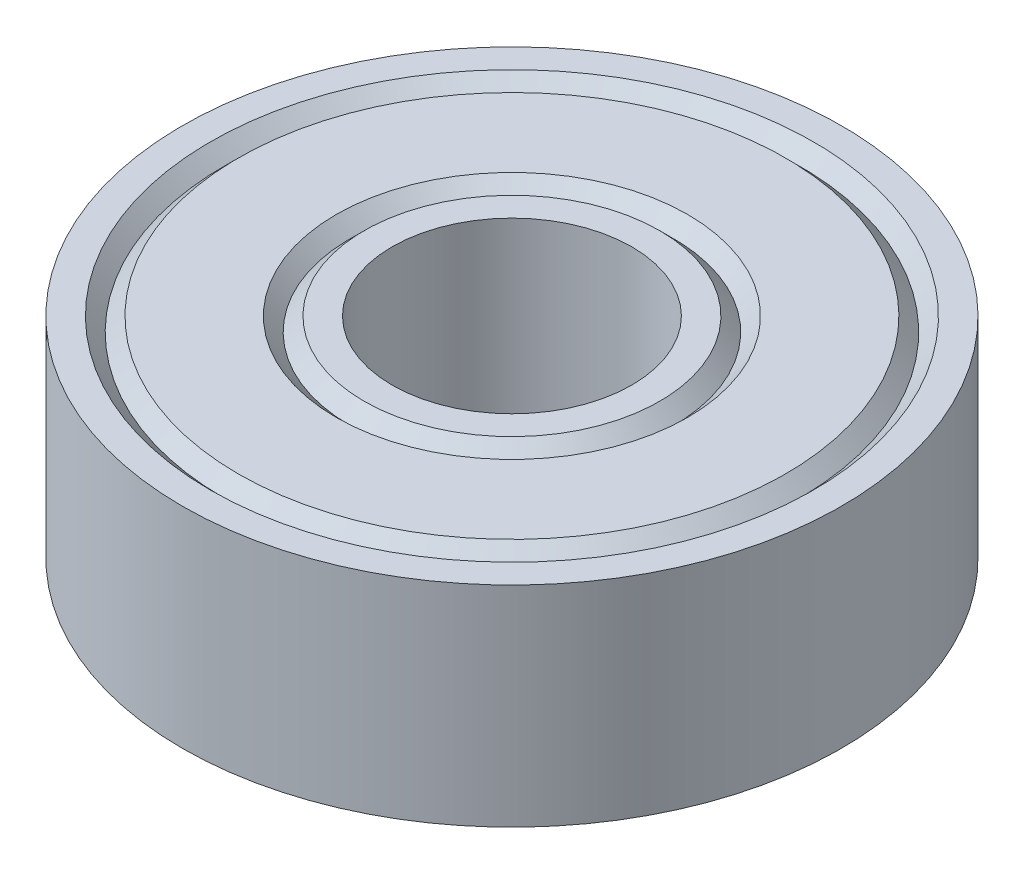
ISO-10303-21;
HEADER;
FILE_DESCRIPTION(('STEP AP214'),'2;1');
FILE_NAME('part.step','',(''),(''),'','','');
FILE_SCHEMA(('AUTOMOTIVE_DESIGN { 1 0 10303 214 1 1 1 1 }'));
ENDSEC;
DATA;
#1=APPLICATION_CONTEXT('core data for automotive mechanical design processes');
#2=APPLICATION_PROTOCOL_DEFINITION('international standard','automotive_design',2000,#1);
#3=PRODUCT_CONTEXT('',#1,'mechanical');
#4=PRODUCT('Part','Part','',(#3));
#5=PRODUCT_RELATED_PRODUCT_CATEGORY('part','',(#4));
#6=PRODUCT_DEFINITION_FORMATION('','',#4);
#7=PRODUCT_DEFINITION_CONTEXT('part definition',#1,'design');
#8=PRODUCT_DEFINITION('design','',#6,#7);
#9=PRODUCT_DEFINITION_SHAPE('','',#8);
#10=(LENGTH_UNIT() NAMED_UNIT(*) SI_UNIT(.MILLI.,.METRE.));
#11=(NAMED_UNIT(*) PLANE_ANGLE_UNIT() SI_UNIT($,.RADIAN.));
#12=(NAMED_UNIT(*) SI_UNIT($,.STERADIAN.) SOLID_ANGLE_UNIT());
#13=UNCERTAINTY_MEASURE_WITH_UNIT(LENGTH_MEASURE(1.E-05),#10,'distance_accuracy_value','');
#14=(GEOMETRIC_REPRESENTATION_CONTEXT(3) GLOBAL_UNCERTAINTY_ASSIGNED_CONTEXT((#13)) GLOBAL_UNIT_ASSIGNED_CONTEXT((#10,
#11,#12)) REPRESENTATION_CONTEXT('',''));
#15=CARTESIAN_POINT('',(0.,0.,0.));
#16=DIRECTION('',(0.,0.,1.));
#17=DIRECTION('',(1.,0.,0.));
#18=AXIS2_PLACEMENT_3D('',#15,#16,#17);
#19=CARTESIAN_POINT('',(0.,3.5,0.));
#20=DIRECTION('',(0.,1.,0.));
#21=DIRECTION('',(0.,0.,1.));
#22=AXIS2_PLACEMENT_3D('',#19,#20,#21);
#23=CYLINDRICAL_SURFACE('',#22,4.);
#24=CARTESIAN_POINT('',(0.,3.5,0.));
#25=DIRECTION('',(0.,1.,0.));
#26=DIRECTION('',(0.,0.,1.));
#27=AXIS2_PLACEMENT_3D('',#24,#25,#26);
#28=CIRCLE('',#27,4.);
#29=CARTESIAN_POINT('',(0.,3.5,4.));
#30=VERTEX_POINT('',#29);
#31=EDGE_CURVE('E84',#30,#30,#28,.T.);
#32=ORIENTED_EDGE('',*,*,#31,.T.);
#33=EDGE_LOOP('',(#32));
#34=FACE_BOUND('',#33,.T.);
#35=CARTESIAN_POINT('',(0.,-3.5,0.));
#36=DIRECTION('',(0.,1.,0.));
#37=DIRECTION('',(0.,0.,1.));
#38=AXIS2_PLACEMENT_3D('',#35,#36,#37);
#39=CIRCLE('',#38,4.);
#40=CARTESIAN_POINT('',(0.,-3.5,4.));
#41=VERTEX_POINT('',#40);
#42=EDGE_CURVE('E10',#41,#41,#39,.T.);
#43=ORIENTED_EDGE('',*,*,#42,.F.);
#44=EDGE_LOOP('',(#43));
#45=FACE_BOUND('',#44,.T.);
#46=ADVANCED_FACE('F32',(#34,#45),#23,.F.);
#47=CARTESIAN_POINT('',(-4.,-3.5,0.));
#48=DIRECTION('',(0.,-1.,0.));
#49=DIRECTION('',(0.,0.,-1.));
#50=AXIS2_PLACEMENT_3D('',#47,#48,#49);
#51=PLANE('',#50);
#52=ORIENTED_EDGE('',*,*,#42,.T.);
#53=EDGE_LOOP('',(#52));
#54=FACE_BOUND('',#53,.T.);
#55=CARTESIAN_POINT('',(0.,-3.5,0.));
#56=DIRECTION('',(0.,1.,0.));
#57=DIRECTION('',(0.,0.,1.));
#58=AXIS2_PLACEMENT_3D('',#55,#56,#57);
#59=CIRCLE('',#58,4.93333333333333);
#60=CARTESIAN_POINT('',(0.,-3.5,4.93333333333333));
#61=VERTEX_POINT('',#60);
#62=EDGE_CURVE('E38',#61,#61,#59,.T.);
#63=ORIENTED_EDGE('',*,*,#62,.F.);
#64=EDGE_LOOP('',(#63));
#65=FACE_BOUND('',#64,.T.);
#66=ADVANCED_FACE('F102',(#54,#65),#51,.T.);
#67=CARTESIAN_POINT('',(0.,-3.03333333333333,0.));
#68=DIRECTION('',(0.,1.,0.));
#69=DIRECTION('',(0.,0.,1.));
#70=AXIS2_PLACEMENT_3D('',#67,#68,#69);
#71=CONICAL_SURFACE('',#70,5.4,0.785398163397452);
#72=ORIENTED_EDGE('',*,*,#62,.T.);
#73=EDGE_LOOP('',(#72));
#74=FACE_BOUND('',#73,.T.);
#75=CARTESIAN_POINT('',(0.,-3.03333333333333,0.));
#76=DIRECTION('',(0.,1.,0.));
#77=DIRECTION('',(0.,0.,1.));
#78=AXIS2_PLACEMENT_3D('',#75,#76,#77);
#79=CIRCLE('',#78,5.4);
#80=CARTESIAN_POINT('',(0.,-3.03333333333333,5.4));
#81=VERTEX_POINT('',#80);
#82=EDGE_CURVE('E42',#81,#81,#79,.T.);
#83=ORIENTED_EDGE('',*,*,#82,.F.);
#84=EDGE_LOOP('',(#83));
#85=FACE_BOUND('',#84,.T.);
#86=ADVANCED_FACE('F106',(#74,#85),#71,.T.);
#87=CARTESIAN_POINT('',(0.,-3.5,0.));
#88=DIRECTION('',(0.,-1.,0.));
#89=DIRECTION('',(0.,0.,-1.));
#90=AXIS2_PLACEMENT_3D('',#87,#88,#89);
#91=CONICAL_SURFACE('',#90,5.86666666666667,0.785398163397447);
#92=ORIENTED_EDGE('',*,*,#82,.T.);
#93=EDGE_LOOP('',(#92));
#94=FACE_BOUND('',#93,.T.);
#95=CARTESIAN_POINT('',(0.,-3.5,0.));
#96=DIRECTION('',(0.,1.,0.));
#97=DIRECTION('',(0.,0.,1.));
#98=AXIS2_PLACEMENT_3D('',#95,#96,#97);
#99=CIRCLE('',#98,5.86666666666667);
#100=CARTESIAN_POINT('',(0.,-3.5,5.86666666666667));
#101=VERTEX_POINT('',#100);
#102=EDGE_CURVE('E46',#101,#101,#99,.T.);
#103=ORIENTED_EDGE('',*,*,#102,.F.);
#104=EDGE_LOOP('',(#103));
#105=FACE_BOUND('',#104,.T.);
#106=ADVANCED_FACE('F110',(#94,#105),#91,.F.);
#107=CARTESIAN_POINT('',(-5.86666666666667,-3.5,0.));
#108=DIRECTION('',(0.,-1.,0.));
#109=DIRECTION('',(0.,0.,-1.));
#110=AXIS2_PLACEMENT_3D('',#107,#108,#109);
#111=PLANE('',#110);
#112=ORIENTED_EDGE('',*,*,#102,.T.);
#113=EDGE_LOOP('',(#112));
#114=FACE_BOUND('',#113,.T.);
#115=CARTESIAN_POINT('',(0.,-3.5,0.));
#116=DIRECTION('',(0.,1.,0.));
#117=DIRECTION('',(0.,0.,1.));
#118=AXIS2_PLACEMENT_3D('',#115,#116,#117);
#119=CIRCLE('',#118,9.13333333333333);
#120=CARTESIAN_POINT('',(0.,-3.5,9.13333333333333));
#121=VERTEX_POINT('',#120);
#122=EDGE_CURVE('E51',#121,#121,#119,.T.);
#123=ORIENTED_EDGE('',*,*,#122,.F.);
#124=EDGE_LOOP('',(#123));
#125=FACE_BOUND('',#124,.T.);
#126=ADVANCED_FACE('F116',(#114,#125),#111,.T.);
#127=CARTESIAN_POINT('',(0.,-3.03333333333333,0.));
#128=DIRECTION('',(0.,1.,0.));
#129=DIRECTION('',(0.,0.,1.));
#130=AXIS2_PLACEMENT_3D('',#127,#128,#129);
#131=CONICAL_SURFACE('',#130,9.6,0.785398163397447);
#132=ORIENTED_EDGE('',*,*,#122,.T.);
#133=EDGE_LOOP('',(#132));
#134=FACE_BOUND('',#133,.T.);
#135=CARTESIAN_POINT('',(0.,-3.03333333333333,0.));
#136=DIRECTION('',(0.,1.,0.));
#137=DIRECTION('',(0.,0.,1.));
#138=AXIS2_PLACEMENT_3D('',#135,#136,#137);
#139=CIRCLE('',#138,9.6);
#140=CARTESIAN_POINT('',(0.,-3.03333333333333,9.6));
#141=VERTEX_POINT('',#140);
#142=EDGE_CURVE('E54',#141,#141,#139,.T.);
#143=ORIENTED_EDGE('',*,*,#142,.F.);
#144=EDGE_LOOP('',(#143));
#145=FACE_BOUND('',#144,.T.);
#146=ADVANCED_FACE('F120',(#134,#145),#131,.T.);
#147=CARTESIAN_POINT('',(0.,-3.5,0.));
#148=DIRECTION('',(0.,-1.,0.));
#149=DIRECTION('',(0.,0.,-1.));
#150=AXIS2_PLACEMENT_3D('',#147,#148,#149);
#151=CONICAL_SURFACE('',#150,10.0666666666667,0.785398163397447);
#152=ORIENTED_EDGE('',*,*,#142,.T.);
#153=EDGE_LOOP('',(#152));
#154=FACE_BOUND('',#153,.T.);
#155=CARTESIAN_POINT('',(0.,-3.5,0.));
#156=DIRECTION('',(0.,1.,0.));
#157=DIRECTION('',(0.,0.,1.));
#158=AXIS2_PLACEMENT_3D('',#155,#156,#157);
#159=CIRCLE('',#158,10.0666666666667);
#160=CARTESIAN_POINT('',(0.,-3.5,10.0666666666667));
#161=VERTEX_POINT('',#160);
#162=EDGE_CURVE('E57',#161,#161,#159,.T.);
#163=ORIENTED_EDGE('',*,*,#162,.F.);
#164=EDGE_LOOP('',(#163));
#165=FACE_BOUND('',#164,.T.);
#166=ADVANCED_FACE('F124',(#154,#165),#151,.F.);
#167=CARTESIAN_POINT('',(-10.0666666666667,-3.5,0.));
#168=DIRECTION('',(0.,-1.,0.));
#169=DIRECTION('',(0.,0.,-1.));
#170=AXIS2_PLACEMENT_3D('',#167,#168,#169);
#171=PLANE('',#170);
#172=ORIENTED_EDGE('',*,*,#162,.T.);
#173=EDGE_LOOP('',(#172));
#174=FACE_BOUND('',#173,.T.);
#175=CARTESIAN_POINT('',(0.,-3.5,0.));
#176=DIRECTION('',(0.,1.,0.));
#177=DIRECTION('',(0.,0.,1.));
#178=AXIS2_PLACEMENT_3D('',#175,#176,#177);
#179=CIRCLE('',#178,11.);
#180=CARTESIAN_POINT('',(0.,-3.5,11.));
#181=VERTEX_POINT('',#180);
#182=EDGE_CURVE('E60',#181,#181,#179,.T.);
#183=ORIENTED_EDGE('',*,*,#182,.F.);
#184=EDGE_LOOP('',(#183));
#185=FACE_BOUND('',#184,.T.);
#186=ADVANCED_FACE('F128',(#174,#185),#171,.T.);
#187=CARTESIAN_POINT('',(0.,3.5,0.));
#188=DIRECTION('',(0.,1.,0.));
#189=DIRECTION('',(0.,0.,1.));
#190=AXIS2_PLACEMENT_3D('',#187,#188,#189);
#191=CYLINDRICAL_SURFACE('',#190,11.);
#192=ORIENTED_EDGE('',*,*,#182,.T.);
#193=EDGE_LOOP('',(#192));
#194=FACE_BOUND('',#193,.T.);
#195=CARTESIAN_POINT('',(0.,3.5,0.));
#196=DIRECTION('',(0.,1.,0.));
#197=DIRECTION('',(0.,0.,1.));
#198=AXIS2_PLACEMENT_3D('',#195,#196,#197);
#199=CIRCLE('',#198,11.);
#200=CARTESIAN_POINT('',(0.,3.5,11.));
#201=VERTEX_POINT('',#200);
#202=EDGE_CURVE('E63',#201,#201,#199,.T.);
#203=ORIENTED_EDGE('',*,*,#202,.F.);
#204=EDGE_LOOP('',(#203));
#205=FACE_BOUND('',#204,.T.);
#206=ADVANCED_FACE('F132',(#194,#205),#191,.T.);
#207=CARTESIAN_POINT('',(-10.0666666666667,3.5,0.));
#208=DIRECTION('',(0.,1.,0.));
#209=DIRECTION('',(0.,0.,1.));
#210=AXIS2_PLACEMENT_3D('',#207,#208,#209);
#211=PLANE('',#210);
#212=ORIENTED_EDGE('',*,*,#202,.T.);
#213=EDGE_LOOP('',(#212));
#214=FACE_BOUND('',#213,.T.);
#215=CARTESIAN_POINT('',(0.,3.5,0.));
#216=DIRECTION('',(0.,1.,0.));
#217=DIRECTION('',(0.,0.,1.));
#218=AXIS2_PLACEMENT_3D('',#215,#216,#217);
#219=CIRCLE('',#218,10.0666666666667);
#220=CARTESIAN_POINT('',(0.,3.5,10.0666666666667));
#221=VERTEX_POINT('',#220);
#222=EDGE_CURVE('E66',#221,#221,#219,.T.);
#223=ORIENTED_EDGE('',*,*,#222,.F.);
#224=EDGE_LOOP('',(#223));
#225=FACE_BOUND('',#224,.T.);
#226=ADVANCED_FACE('F136',(#214,#225),#211,.T.);
#227=CARTESIAN_POINT('',(0.,3.03333333333333,0.));
#228=DIRECTION('',(0.,1.,0.));
#229=DIRECTION('',(0.,0.,1.));
#230=AXIS2_PLACEMENT_3D('',#227,#228,#229);
#231=CONICAL_SURFACE('',#230,9.6,0.785398163397447);
#232=ORIENTED_EDGE('',*,*,#222,.T.);
#233=EDGE_LOOP('',(#232));
#234=FACE_BOUND('',#233,.T.);
#235=CARTESIAN_POINT('',(0.,3.03333333333333,0.));
#236=DIRECTION('',(0.,1.,0.));
#237=DIRECTION('',(0.,0.,1.));
#238=AXIS2_PLACEMENT_3D('',#235,#236,#237);
#239=CIRCLE('',#238,9.6);
#240=CARTESIAN_POINT('',(0.,3.03333333333333,9.6));
#241=VERTEX_POINT('',#240);
#242=EDGE_CURVE('E69',#241,#241,#239,.T.);
#243=ORIENTED_EDGE('',*,*,#242,.F.);
#244=EDGE_LOOP('',(#243));
#245=FACE_BOUND('',#244,.T.);
#246=ADVANCED_FACE('F140',(#234,#245),#231,.F.);
#247=CARTESIAN_POINT('',(0.,3.5,0.));
#248=DIRECTION('',(0.,-1.,0.));
#249=DIRECTION('',(0.,0.,-1.));
#250=AXIS2_PLACEMENT_3D('',#247,#248,#249);
#251=CONICAL_SURFACE('',#250,9.13333333333333,0.785398163397447);
#252=ORIENTED_EDGE('',*,*,#242,.T.);
#253=EDGE_LOOP('',(#252));
#254=FACE_BOUND('',#253,.T.);
#255=CARTESIAN_POINT('',(0.,3.5,0.));
#256=DIRECTION('',(0.,1.,0.));
#257=DIRECTION('',(0.,0.,1.));
#258=AXIS2_PLACEMENT_3D('',#255,#256,#257);
#259=CIRCLE('',#258,9.13333333333333);
#260=CARTESIAN_POINT('',(0.,3.5,9.13333333333333));
#261=VERTEX_POINT('',#260);
#262=EDGE_CURVE('E72',#261,#261,#259,.T.);
#263=ORIENTED_EDGE('',*,*,#262,.F.);
#264=EDGE_LOOP('',(#263));
#265=FACE_BOUND('',#264,.T.);
#266=ADVANCED_FACE('F144',(#254,#265),#251,.T.);
#267=CARTESIAN_POINT('',(-5.86666666666667,3.5,0.));
#268=DIRECTION('',(0.,1.,0.));
#269=DIRECTION('',(0.,0.,1.));
#270=AXIS2_PLACEMENT_3D('',#267,#268,#269);
#271=PLANE('',#270);
#272=ORIENTED_EDGE('',*,*,#262,.T.);
#273=EDGE_LOOP('',(#272));
#274=FACE_BOUND('',#273,.T.);
#275=CARTESIAN_POINT('',(0.,3.5,0.));
#276=DIRECTION('',(0.,1.,0.));
#277=DIRECTION('',(0.,0.,1.));
#278=AXIS2_PLACEMENT_3D('',#275,#276,#277);
#279=CIRCLE('',#278,5.86666666666667);
#280=CARTESIAN_POINT('',(0.,3.5,5.86666666666667));
#281=VERTEX_POINT('',#280);
#282=EDGE_CURVE('E75',#281,#281,#279,.T.);
#283=ORIENTED_EDGE('',*,*,#282,.F.);
#284=EDGE_LOOP('',(#283));
#285=FACE_BOUND('',#284,.T.);
#286=ADVANCED_FACE('F148',(#274,#285),#271,.T.);
#287=CARTESIAN_POINT('',(0.,3.03333333333333,0.));
#288=DIRECTION('',(0.,1.,0.));
#289=DIRECTION('',(0.,0.,1.));
#290=AXIS2_PLACEMENT_3D('',#287,#288,#289);
#291=CONICAL_SURFACE('',#290,5.4,0.785398163397447);
#292=ORIENTED_EDGE('',*,*,#282,.T.);
#293=EDGE_LOOP('',(#292));
#294=FACE_BOUND('',#293,.T.);
#295=CARTESIAN_POINT('',(0.,3.03333333333333,0.));
#296=DIRECTION('',(0.,1.,0.));
#297=DIRECTION('',(0.,0.,1.));
#298=AXIS2_PLACEMENT_3D('',#295,#296,#297);
#299=CIRCLE('',#298,5.4);
#300=CARTESIAN_POINT('',(0.,3.03333333333333,5.4));
#301=VERTEX_POINT('',#300);
#302=EDGE_CURVE('E78',#301,#301,#299,.T.);
#303=ORIENTED_EDGE('',*,*,#302,.F.);
#304=EDGE_LOOP('',(#303));
#305=FACE_BOUND('',#304,.T.);
#306=ADVANCED_FACE('F98',(#294,#305),#291,.F.);
#307=CARTESIAN_POINT('',(0.,3.5,0.));
#308=DIRECTION('',(0.,-1.,0.));
#309=DIRECTION('',(0.,0.,-1.));
#310=AXIS2_PLACEMENT_3D('',#307,#308,#309);
#311=CONICAL_SURFACE('',#310,4.93333333333333,0.78539816339745);
#312=ORIENTED_EDGE('',*,*,#302,.T.);
#313=EDGE_LOOP('',(#312));
#314=FACE_BOUND('',#313,.T.);
#315=CARTESIAN_POINT('',(0.,3.5,0.));
#316=DIRECTION('',(0.,1.,0.));
#317=DIRECTION('',(0.,0.,1.));
#318=AXIS2_PLACEMENT_3D('',#315,#316,#317);
#319=CIRCLE('',#318,4.93333333333333);
#320=CARTESIAN_POINT('',(0.,3.5,4.93333333333333));
#321=VERTEX_POINT('',#320);
#322=EDGE_CURVE('E81',#321,#321,#319,.T.);
#323=ORIENTED_EDGE('',*,*,#322,.F.);
#324=EDGE_LOOP('',(#323));
#325=FACE_BOUND('',#324,.T.);
#326=ADVANCED_FACE('F92',(#314,#325),#311,.T.);
#327=CARTESIAN_POINT('',(-4.,3.5,0.));
#328=DIRECTION('',(0.,1.,0.));
#329=DIRECTION('',(0.,0.,1.));
#330=AXIS2_PLACEMENT_3D('',#327,#328,#329);
#331=PLANE('',#330);
#332=ORIENTED_EDGE('',*,*,#322,.T.);
#333=EDGE_LOOP('',(#332));
#334=FACE_BOUND('',#333,.T.);
#335=ORIENTED_EDGE('',*,*,#31,.F.);
#336=EDGE_LOOP('',(#335));
#337=FACE_BOUND('',#336,.T.);
#338=ADVANCED_FACE('F90',(#334,#337),#331,.T.);
#339=CLOSED_SHELL('',(#46,#66,#86,#106,#126,#146,#166,#186,#206,#226,#246,#266,#286,#306,#326,#338));
#340=MANIFOLD_SOLID_BREP('B2',#339);
#341=ADVANCED_BREP_SHAPE_REPRESENTATION('',(#18,#340),#14);
#342=SHAPE_DEFINITION_REPRESENTATION(#9,#341);
ENDSEC;
END-ISO-10303-21;
